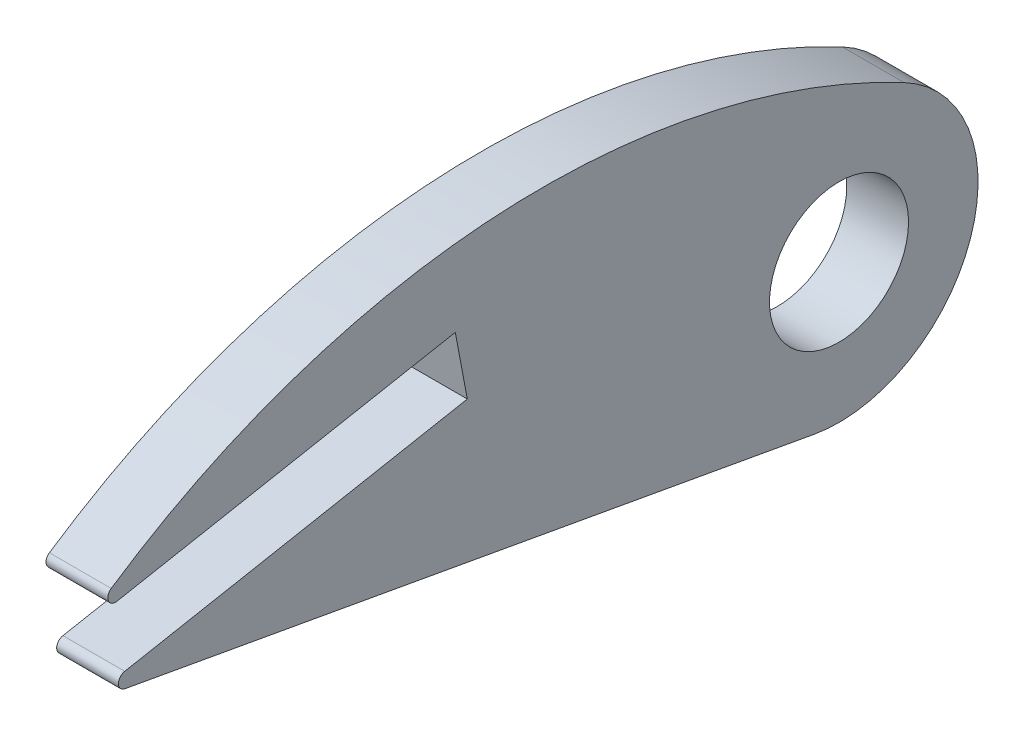
ISO-10303-21;
HEADER;
FILE_DESCRIPTION(('STEP AP214'),'2;1');
FILE_NAME('part.step','',(''),(''),'','','');
FILE_SCHEMA(('AUTOMOTIVE_DESIGN { 1 0 10303 214 1 1 1 1 }'));
ENDSEC;
DATA;
#1=APPLICATION_CONTEXT('core data for automotive mechanical design processes');
#2=APPLICATION_PROTOCOL_DEFINITION('international standard','automotive_design',2000,#1);
#3=PRODUCT_CONTEXT('',#1,'mechanical');
#4=PRODUCT('Part','Part','',(#3));
#5=PRODUCT_RELATED_PRODUCT_CATEGORY('part','',(#4));
#6=PRODUCT_DEFINITION_FORMATION('','',#4);
#7=PRODUCT_DEFINITION_CONTEXT('part definition',#1,'design');
#8=PRODUCT_DEFINITION('design','',#6,#7);
#9=PRODUCT_DEFINITION_SHAPE('','',#8);
#10=(LENGTH_UNIT() NAMED_UNIT(*) SI_UNIT(.MILLI.,.METRE.));
#11=(NAMED_UNIT(*) PLANE_ANGLE_UNIT() SI_UNIT($,.RADIAN.));
#12=(NAMED_UNIT(*) SI_UNIT($,.STERADIAN.) SOLID_ANGLE_UNIT());
#13=UNCERTAINTY_MEASURE_WITH_UNIT(LENGTH_MEASURE(1.E-05),#10,'distance_accuracy_value','');
#14=(GEOMETRIC_REPRESENTATION_CONTEXT(3) GLOBAL_UNCERTAINTY_ASSIGNED_CONTEXT((#13)) GLOBAL_UNIT_ASSIGNED_CONTEXT((#10,
#11,#12)) REPRESENTATION_CONTEXT('',''));
#15=CARTESIAN_POINT('',(0.,0.,0.));
#16=DIRECTION('',(0.,0.,1.));
#17=DIRECTION('',(1.,0.,0.));
#18=AXIS2_PLACEMENT_3D('',#15,#16,#17);
#19=CARTESIAN_POINT('',(-223.918926936471,87.0700000000005,-160.18));
#20=DIRECTION('',(1.,0.,0.));
#21=DIRECTION('',(0.,0.,-1.));
#22=AXIS2_PLACEMENT_3D('',#19,#20,#21);
#23=CYLINDRICAL_SURFACE('',#22,4.49999999999999);
#24=CARTESIAN_POINT('',(-223.918926936471,87.0700000000005,-160.18));
#25=DIRECTION('',(1.,0.,0.));
#26=DIRECTION('',(0.,0.,-1.));
#27=AXIS2_PLACEMENT_3D('',#24,#25,#26);
#28=CIRCLE('',#27,4.49999999999999);
#29=CARTESIAN_POINT('',(-223.918926936471,87.0700000000005,-164.68));
#30=VERTEX_POINT('',#29);
#31=EDGE_CURVE('E146',#30,#30,#28,.T.);
#32=ORIENTED_EDGE('',*,*,#31,.F.);
#33=EDGE_LOOP('',(#32));
#34=FACE_BOUND('',#33,.T.);
#35=CARTESIAN_POINT('',(-219.918926936471,87.0700000000005,-160.18));
#36=DIRECTION('',(1.,0.,0.));
#37=DIRECTION('',(0.,0.,-1.));
#38=AXIS2_PLACEMENT_3D('',#35,#36,#37);
#39=CIRCLE('',#38,4.49999999999999);
#40=CARTESIAN_POINT('',(-219.918926936471,87.0700000000005,-164.68));
#41=VERTEX_POINT('',#40);
#42=EDGE_CURVE('E164',#41,#41,#39,.T.);
#43=ORIENTED_EDGE('',*,*,#42,.T.);
#44=EDGE_LOOP('',(#43));
#45=FACE_BOUND('',#44,.T.);
#46=ADVANCED_FACE('F40',(#34,#45),#23,.F.);
#47=CARTESIAN_POINT('',(-223.918926936471,87.0700000000005,-160.18));
#48=DIRECTION('',(1.,0.,0.));
#49=DIRECTION('',(0.,0.,-1.));
#50=AXIS2_PLACEMENT_3D('',#47,#48,#49);
#51=CYLINDRICAL_SURFACE('',#50,9.);
#52=CARTESIAN_POINT('',(-219.918926936471,87.0700000000005,-160.18));
#53=DIRECTION('',(1.,0.,0.));
#54=DIRECTION('',(0.,0.,1.));
#55=AXIS2_PLACEMENT_3D('',#52,#53,#54);
#56=CIRCLE('',#55,9.);
#57=CARTESIAN_POINT('',(-219.918926936471,78.2127742311918,-158.58326843823));
#58=VERTEX_POINT('',#57);
#59=CARTESIAN_POINT('',(-219.918926936471,95.0219164121472,-164.395094942493));
#60=VERTEX_POINT('',#59);
#61=EDGE_CURVE('E122',#58,#60,#56,.T.);
#62=ORIENTED_EDGE('',*,*,#61,.F.);
#63=DIRECTION('',(1.,0.,0.));
#64=VECTOR('',#63,1.);
#65=CARTESIAN_POINT('',(-223.918926936471,78.2127742311918,-158.58326843823));
#66=LINE('',#65,#64);
#67=CARTESIAN_POINT('',(-223.918926936471,78.2127742311918,-158.58326843823));
#68=VERTEX_POINT('',#67);
#69=EDGE_CURVE('E132',#68,#58,#66,.T.);
#70=ORIENTED_EDGE('',*,*,#69,.F.);
#71=CARTESIAN_POINT('',(-223.918926936471,87.0700000000005,-160.18));
#72=DIRECTION('',(1.,0.,0.));
#73=DIRECTION('',(0.,0.,1.));
#74=AXIS2_PLACEMENT_3D('',#71,#72,#73);
#75=CIRCLE('',#74,9.);
#76=CARTESIAN_POINT('',(-223.918926936471,95.0219164121472,-164.395094942493));
#77=VERTEX_POINT('',#76);
#78=EDGE_CURVE('E161',#68,#77,#75,.T.);
#79=ORIENTED_EDGE('',*,*,#78,.T.);
#80=DIRECTION('',(1.,0.,0.));
#81=VECTOR('',#80,1.);
#82=CARTESIAN_POINT('',(-223.918926936471,95.0219164121472,-164.395094942493));
#83=LINE('',#82,#81);
#84=EDGE_CURVE('E144',#77,#60,#83,.T.);
#85=ORIENTED_EDGE('',*,*,#84,.T.);
#86=EDGE_LOOP('',(#62,#70,#79,#85));
#87=FACE_BOUND('',#86,.T.);
#88=ADVANCED_FACE('F143',(#87),#51,.T.);
#89=CARTESIAN_POINT('',(-223.918926936471,78.2127742311918,-158.58326843823));
#90=DIRECTION('',(0.,-0.984136196534293,0.177414617974436));
#91=DIRECTION('',(0.,-0.177414617974436,-0.984136196534293));
#92=AXIS2_PLACEMENT_3D('',#89,#90,#91);
#93=PLANE('',#92);
#94=DIRECTION('',(0.,-0.177414617974436,-0.984136196534293));
#95=VECTOR('',#94,1.);
#96=CARTESIAN_POINT('',(-219.918926936471,78.2127742311918,-158.58326843823));
#97=LINE('',#96,#95);
#98=CARTESIAN_POINT('',(-219.918926936471,86.2597861826909,-113.945707983344));
#99=VERTEX_POINT('',#98);
#100=EDGE_CURVE('E117',#99,#58,#97,.T.);
#101=ORIENTED_EDGE('',*,*,#100,.F.);
#102=DIRECTION('',(-1.,0.,0.));
#103=VECTOR('',#102,1.);
#104=CARTESIAN_POINT('',(-223.918926936471,86.2597861826909,-113.945707983344));
#105=LINE('',#104,#103);
#106=CARTESIAN_POINT('',(-223.918926936471,86.2597861826909,-113.945707983344));
#107=VERTEX_POINT('',#106);
#108=EDGE_CURVE('E193',#99,#107,#105,.T.);
#109=ORIENTED_EDGE('',*,*,#108,.T.);
#110=DIRECTION('',(0.,-0.177414617974436,-0.984136196534293));
#111=VECTOR('',#110,1.);
#112=CARTESIAN_POINT('',(-223.918926936471,78.2127742311918,-158.58326843823));
#113=LINE('',#112,#111);
#114=EDGE_CURVE('E135',#107,#68,#113,.T.);
#115=ORIENTED_EDGE('',*,*,#114,.T.);
#116=ORIENTED_EDGE('',*,*,#69,.T.);
#117=EDGE_LOOP('',(#101,#109,#115,#116));
#118=FACE_BOUND('',#117,.T.);
#119=ADVANCED_FACE('F133',(#118),#93,.T.);
#120=CARTESIAN_POINT('',(-99.9943656155855,35.6903819791565,159.740893755476));
#121=DIRECTION('',(0.,0.982717494039836,0.185111660648554));
#122=DIRECTION('',(0.,-0.185111660648554,0.982717494039836));
#123=AXIS2_PLACEMENT_3D('',#120,#121,#122);
#124=PLANE('',#123);
#125=DIRECTION('',(0.,-0.185111660648554,0.982717494039836));
#126=VECTOR('',#125,1.);
#127=CARTESIAN_POINT('',(-223.918926936471,90.9141593463482,-133.430114032813));
#128=LINE('',#127,#126);
#129=CARTESIAN_POINT('',(-223.918926936471,91.4202394166609,-136.116782915469));
#130=VERTEX_POINT('',#129);
#131=CARTESIAN_POINT('',(-223.918926936471,87.243213027978,-113.941859462007));
#132=VERTEX_POINT('',#131);
#133=EDGE_CURVE('E140',#130,#132,#128,.T.);
#134=ORIENTED_EDGE('',*,*,#133,.T.);
#135=DIRECTION('',(-1.,0.,0.));
#136=VECTOR('',#135,1.);
#137=CARTESIAN_POINT('',(-99.9943656155855,87.243213027978,-113.941859462007));
#138=LINE('',#137,#136);
#139=CARTESIAN_POINT('',(-219.918926936471,87.243213027978,-113.941859462007));
#140=VERTEX_POINT('',#139);
#141=EDGE_CURVE('E202',#132,#140,#138,.F.);
#142=ORIENTED_EDGE('',*,*,#141,.T.);
#143=DIRECTION('',(0.,-0.185111660648549,0.982717494039837));
#144=VECTOR('',#143,1.);
#145=CARTESIAN_POINT('',(-219.918926936471,90.9141593463482,-133.430114032813));
#146=LINE('',#145,#144);
#147=CARTESIAN_POINT('',(-219.918926936471,91.4202394166609,-136.116782915469));
#148=VERTEX_POINT('',#147);
#149=EDGE_CURVE('E129',#148,#140,#146,.T.);
#150=ORIENTED_EDGE('',*,*,#149,.F.);
#151=DIRECTION('',(1.,0.,0.));
#152=VECTOR('',#151,1.);
#153=CARTESIAN_POINT('',(-385.855743978742,91.4202394166609,-136.116782915469));
#154=LINE('',#153,#152);
#155=EDGE_CURVE('E181',#130,#148,#154,.T.);
#156=ORIENTED_EDGE('',*,*,#155,.F.);
#157=EDGE_LOOP('',(#134,#142,#150,#156));
#158=FACE_BOUND('',#157,.T.);
#159=ADVANCED_FACE('F227',(#158),#124,.T.);
#160=CARTESIAN_POINT('',(-223.918926936471,50.8446030113319,-140.977900817531));
#161=DIRECTION('',(1.,0.,0.));
#162=DIRECTION('',(0.,0.,-1.));
#163=AXIS2_PLACEMENT_3D('',#160,#161,#162);
#164=CYLINDRICAL_SURFACE('',#163,50.);
#165=CARTESIAN_POINT('',(-223.918926936471,50.8446030113319,-140.977900817531));
#166=DIRECTION('',(1.,0.,0.));
#167=DIRECTION('',(0.,0.,1.));
#168=AXIS2_PLACEMENT_3D('',#165,#166,#167);
#169=CIRCLE('',#168,50.);
#170=CARTESIAN_POINT('',(-223.918926936471,92.3281656216581,-113.065286587489));
#171=VERTEX_POINT('',#170);
#172=EDGE_CURVE('E159',#77,#171,#169,.T.);
#173=ORIENTED_EDGE('',*,*,#172,.T.);
#174=DIRECTION('',(1.,0.,0.));
#175=VECTOR('',#174,1.);
#176=CARTESIAN_POINT('',(-223.918926936471,92.3281656216581,-113.065286587489));
#177=LINE('',#176,#175);
#178=CARTESIAN_POINT('',(-219.918926936471,92.3281656216581,-113.065286587489));
#179=VERTEX_POINT('',#178);
#180=EDGE_CURVE('E49',#171,#179,#177,.T.);
#181=ORIENTED_EDGE('',*,*,#180,.T.);
#182=CARTESIAN_POINT('',(-219.918926936471,50.8446030113319,-140.977900817531));
#183=DIRECTION('',(1.,0.,0.));
#184=DIRECTION('',(0.,0.,1.));
#185=AXIS2_PLACEMENT_3D('',#182,#183,#184);
#186=CIRCLE('',#185,50.);
#187=EDGE_CURVE('E155',#60,#179,#186,.T.);
#188=ORIENTED_EDGE('',*,*,#187,.F.);
#189=ORIENTED_EDGE('',*,*,#84,.F.);
#190=EDGE_LOOP('',(#173,#181,#188,#189));
#191=FACE_BOUND('',#190,.T.);
#192=ADVANCED_FACE('F208',(#191),#164,.T.);
#193=CARTESIAN_POINT('',(-219.918926936471,50.8446030113319,-140.977900817531));
#194=DIRECTION('',(1.,0.,0.));
#195=DIRECTION('',(0.,0.,1.));
#196=AXIS2_PLACEMENT_3D('',#193,#194,#195);
#197=PLANE('',#196);
#198=ORIENTED_EDGE('',*,*,#42,.F.);
#199=EDGE_LOOP('',(#198));
#200=FACE_BOUND('',#199,.T.);
#201=ORIENTED_EDGE('',*,*,#149,.T.);
#202=CARTESIAN_POINT('',(-219.918926936471,86.7518542809581,-114.034415292332));
#203=DIRECTION('',(1.,0.,0.));
#204=DIRECTION('',(0.,0.,-1.));
#205=AXIS2_PLACEMENT_3D('',#202,#203,#204);
#206=CIRCLE('',#205,0.5);
#207=EDGE_CURVE('E124',#140,#99,#206,.T.);
#208=ORIENTED_EDGE('',*,*,#207,.T.);
#209=ORIENTED_EDGE('',*,*,#100,.T.);
#210=ORIENTED_EDGE('',*,*,#61,.T.);
#211=ORIENTED_EDGE('',*,*,#187,.T.);
#212=CARTESIAN_POINT('',(-219.918926936471,91.9133299955548,-113.34441272979));
#213=DIRECTION('',(1.,0.,0.));
#214=DIRECTION('',(0.,0.,-1.));
#215=AXIS2_PLACEMENT_3D('',#212,#213,#214);
#216=CIRCLE('',#215,0.5);
#217=CARTESIAN_POINT('',(-219.918926936471,91.4219712485349,-113.436968560114));
#218=VERTEX_POINT('',#217);
#219=EDGE_CURVE('E56',#179,#218,#216,.T.);
#220=ORIENTED_EDGE('',*,*,#219,.T.);
#221=DIRECTION('',(0.,0.185111660648554,-0.982717494039836));
#222=VECTOR('',#221,1.);
#223=CARTESIAN_POINT('',(-219.918926936471,95.0415728213154,-132.652645058089));
#224=LINE('',#223,#222);
#225=CARTESIAN_POINT('',(-219.918926936471,95.5476528916282,-135.339313940745));
#226=VERTEX_POINT('',#225);
#227=EDGE_CURVE('E158',#218,#226,#224,.T.);
#228=ORIENTED_EDGE('',*,*,#227,.T.);
#229=DIRECTION('',(0.,-0.982717494039835,-0.185111660648557));
#230=VECTOR('',#229,1.);
#231=CARTESIAN_POINT('',(-219.918926936471,51.3506830816447,-143.664569700188));
#232=LINE('',#231,#230);
#233=EDGE_CURVE('E176',#226,#148,#232,.T.);
#234=ORIENTED_EDGE('',*,*,#233,.T.);
#235=EDGE_LOOP('',(#201,#208,#209,#210,#211,#220,#228,#234));
#236=FACE_BOUND('',#235,.T.);
#237=ADVANCED_FACE('F120',(#200,#236),#197,.T.);
#238=CARTESIAN_POINT('',(-223.918926936471,50.8446030113319,-140.977900817531));
#239=DIRECTION('',(1.,0.,0.));
#240=DIRECTION('',(0.,0.,1.));
#241=AXIS2_PLACEMENT_3D('',#238,#239,#240);
#242=PLANE('',#241);
#243=ORIENTED_EDGE('',*,*,#31,.T.);
#244=EDGE_LOOP('',(#243));
#245=FACE_BOUND('',#244,.T.);
#246=ORIENTED_EDGE('',*,*,#114,.F.);
#247=CARTESIAN_POINT('',(-223.918926936471,86.7518542809581,-114.034415292332));
#248=DIRECTION('',(1.,0.,0.));
#249=DIRECTION('',(0.,0.,-1.));
#250=AXIS2_PLACEMENT_3D('',#247,#248,#249);
#251=CIRCLE('',#250,0.5);
#252=EDGE_CURVE('E199',#107,#132,#251,.F.);
#253=ORIENTED_EDGE('',*,*,#252,.T.);
#254=ORIENTED_EDGE('',*,*,#133,.F.);
#255=DIRECTION('',(0.,-0.982717494039835,-0.185111660648557));
#256=VECTOR('',#255,1.);
#257=CARTESIAN_POINT('',(-223.918926936471,51.3506830816447,-143.664569700188));
#258=LINE('',#257,#256);
#259=CARTESIAN_POINT('',(-223.918926936471,95.5476528916282,-135.339313940745));
#260=VERTEX_POINT('',#259);
#261=EDGE_CURVE('E177',#260,#130,#258,.T.);
#262=ORIENTED_EDGE('',*,*,#261,.F.);
#263=DIRECTION('',(0.,0.185111660648554,-0.982717494039836));
#264=VECTOR('',#263,1.);
#265=CARTESIAN_POINT('',(-223.918926936471,95.0415728213154,-132.652645058089));
#266=LINE('',#265,#264);
#267=CARTESIAN_POINT('',(-223.918926936471,91.4219712485349,-113.436968560114));
#268=VERTEX_POINT('',#267);
#269=EDGE_CURVE('E152',#268,#260,#266,.T.);
#270=ORIENTED_EDGE('',*,*,#269,.F.);
#271=CARTESIAN_POINT('',(-223.918926936471,91.9133299955548,-113.34441272979));
#272=DIRECTION('',(1.,0.,0.));
#273=DIRECTION('',(0.,0.,-1.));
#274=AXIS2_PLACEMENT_3D('',#271,#272,#273);
#275=CIRCLE('',#274,0.5);
#276=EDGE_CURVE('E196',#268,#171,#275,.F.);
#277=ORIENTED_EDGE('',*,*,#276,.T.);
#278=ORIENTED_EDGE('',*,*,#172,.F.);
#279=ORIENTED_EDGE('',*,*,#78,.F.);
#280=EDGE_LOOP('',(#246,#253,#254,#262,#270,#277,#278,#279));
#281=FACE_BOUND('',#280,.T.);
#282=ADVANCED_FACE('F213',(#245,#281),#242,.F.);
#283=CARTESIAN_POINT('',(-385.855743978742,95.5291417255633,-135.241042191341));
#284=DIRECTION('',(0.,-0.982717494039836,-0.185111660648554));
#285=DIRECTION('',(0.,0.185111660648554,-0.982717494039836));
#286=AXIS2_PLACEMENT_3D('',#283,#284,#285);
#287=PLANE('',#286);
#288=ORIENTED_EDGE('',*,*,#227,.F.);
#289=DIRECTION('',(1.,0.,0.));
#290=VECTOR('',#289,1.);
#291=CARTESIAN_POINT('',(-385.855743978742,91.4219712485349,-113.436968560114));
#292=LINE('',#291,#290);
#293=EDGE_CURVE('E11',#218,#268,#292,.F.);
#294=ORIENTED_EDGE('',*,*,#293,.T.);
#295=ORIENTED_EDGE('',*,*,#269,.T.);
#296=DIRECTION('',(1.,0.,0.));
#297=VECTOR('',#296,1.);
#298=CARTESIAN_POINT('',(-385.855743978742,95.5476528916282,-135.339313940745));
#299=LINE('',#298,#297);
#300=EDGE_CURVE('E173',#260,#226,#299,.T.);
#301=ORIENTED_EDGE('',*,*,#300,.T.);
#302=EDGE_LOOP('',(#288,#294,#295,#301));
#303=FACE_BOUND('',#302,.T.);
#304=ADVANCED_FACE('F217',(#303),#287,.T.);
#305=CARTESIAN_POINT('',(-385.855743978742,95.4493811422242,-135.35782510681));
#306=DIRECTION('',(0.,-0.185111660648557,0.982717494039835));
#307=DIRECTION('',(0.,-0.982717494039835,-0.185111660648557));
#308=AXIS2_PLACEMENT_3D('',#305,#306,#307);
#309=PLANE('',#308);
#310=ORIENTED_EDGE('',*,*,#261,.T.);
#311=ORIENTED_EDGE('',*,*,#155,.T.);
#312=ORIENTED_EDGE('',*,*,#233,.F.);
#313=ORIENTED_EDGE('',*,*,#300,.F.);
#314=EDGE_LOOP('',(#310,#311,#312,#313));
#315=FACE_BOUND('',#314,.T.);
#316=ADVANCED_FACE('F220',(#315),#309,.T.);
#317=CARTESIAN_POINT('',(-223.918926936471,86.7518542809581,-114.034415292332));
#318=DIRECTION('',(-1.,0.,0.));
#319=DIRECTION('',(0.,0.,1.));
#320=AXIS2_PLACEMENT_3D('',#317,#318,#319);
#321=CYLINDRICAL_SURFACE('',#320,0.5);
#322=ORIENTED_EDGE('',*,*,#207,.F.);
#323=ORIENTED_EDGE('',*,*,#141,.F.);
#324=ORIENTED_EDGE('',*,*,#252,.F.);
#325=ORIENTED_EDGE('',*,*,#108,.F.);
#326=EDGE_LOOP('',(#322,#323,#324,#325));
#327=FACE_BOUND('',#326,.T.);
#328=ADVANCED_FACE('F225',(#327),#321,.T.);
#329=CARTESIAN_POINT('',(-223.918926936471,91.9133299955548,-113.34441272979));
#330=DIRECTION('',(1.,0.,0.));
#331=DIRECTION('',(0.,0.,-1.));
#332=AXIS2_PLACEMENT_3D('',#329,#330,#331);
#333=CYLINDRICAL_SURFACE('',#332,0.5);
#334=ORIENTED_EDGE('',*,*,#276,.F.);
#335=ORIENTED_EDGE('',*,*,#293,.F.);
#336=ORIENTED_EDGE('',*,*,#219,.F.);
#337=ORIENTED_EDGE('',*,*,#180,.F.);
#338=EDGE_LOOP('',(#334,#335,#336,#337));
#339=FACE_BOUND('',#338,.T.);
#340=ADVANCED_FACE('F42',(#339),#333,.T.);
#341=CLOSED_SHELL('',(#46,#88,#119,#159,#192,#237,#282,#304,#316,#328,#340));
#342=MANIFOLD_SOLID_BREP('B2',#341);
#343=ADVANCED_BREP_SHAPE_REPRESENTATION('',(#18,#342),#14);
#344=SHAPE_DEFINITION_REPRESENTATION(#9,#343);
ENDSEC;
END-ISO-10303-21;
